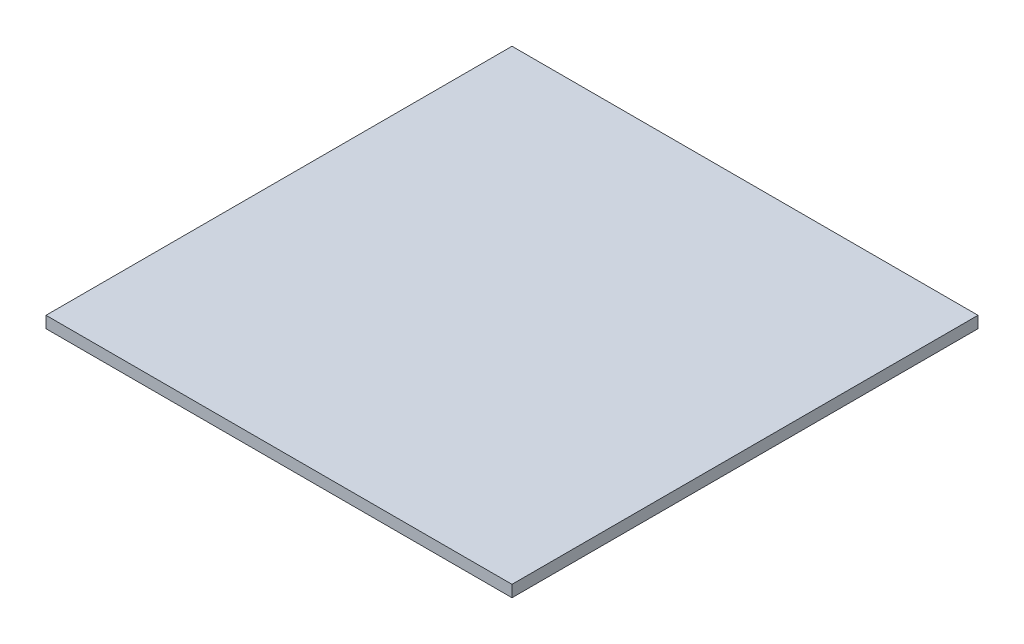
ISO-10303-21;
HEADER;
FILE_DESCRIPTION(('STEP AP214'),'2;1');
FILE_NAME('part.step','',(''),(''),'','','');
FILE_SCHEMA(('AUTOMOTIVE_DESIGN { 1 0 10303 214 1 1 1 1 }'));
ENDSEC;
DATA;
#1=APPLICATION_CONTEXT('core data for automotive mechanical design processes');
#2=APPLICATION_PROTOCOL_DEFINITION('international standard','automotive_design',2000,#1);
#3=PRODUCT_CONTEXT('',#1,'mechanical');
#4=PRODUCT('Part','Part','',(#3));
#5=PRODUCT_RELATED_PRODUCT_CATEGORY('part','',(#4));
#6=PRODUCT_DEFINITION_FORMATION('','',#4);
#7=PRODUCT_DEFINITION_CONTEXT('part definition',#1,'design');
#8=PRODUCT_DEFINITION('design','',#6,#7);
#9=PRODUCT_DEFINITION_SHAPE('','',#8);
#10=(LENGTH_UNIT() NAMED_UNIT(*) SI_UNIT(.MILLI.,.METRE.));
#11=(NAMED_UNIT(*) PLANE_ANGLE_UNIT() SI_UNIT($,.RADIAN.));
#12=(NAMED_UNIT(*) SI_UNIT($,.STERADIAN.) SOLID_ANGLE_UNIT());
#13=UNCERTAINTY_MEASURE_WITH_UNIT(LENGTH_MEASURE(1.E-05),#10,'distance_accuracy_value','');
#14=(GEOMETRIC_REPRESENTATION_CONTEXT(3) GLOBAL_UNCERTAINTY_ASSIGNED_CONTEXT((#13)) GLOBAL_UNIT_ASSIGNED_CONTEXT((#10,
#11,#12)) REPRESENTATION_CONTEXT('',''));
#15=CARTESIAN_POINT('',(0.,0.,0.));
#16=DIRECTION('',(0.,0.,1.));
#17=DIRECTION('',(1.,0.,0.));
#18=AXIS2_PLACEMENT_3D('',#15,#16,#17);
#19=CARTESIAN_POINT('',(2000.,100.,-2000.));
#20=DIRECTION('',(-1.,0.,0.));
#21=DIRECTION('',(0.,0.,1.));
#22=AXIS2_PLACEMENT_3D('',#19,#20,#21);
#23=PLANE('',#22);
#24=DIRECTION('',(0.,0.,-1.));
#25=VECTOR('',#24,1.);
#26=CARTESIAN_POINT('',(2000.,0.,-2000.));
#27=LINE('',#26,#25);
#28=CARTESIAN_POINT('',(2000.,0.,2000.));
#29=VERTEX_POINT('',#28);
#30=CARTESIAN_POINT('',(2000.,0.,-2000.));
#31=VERTEX_POINT('',#30);
#32=EDGE_CURVE('E107',#29,#31,#27,.T.);
#33=ORIENTED_EDGE('',*,*,#32,.T.);
#34=DIRECTION('',(0.,-1.,0.));
#35=VECTOR('',#34,1.);
#36=CARTESIAN_POINT('',(2000.,100.,-2000.));
#37=LINE('',#36,#35);
#38=CARTESIAN_POINT('',(2000.,100.,-2000.));
#39=VERTEX_POINT('',#38);
#40=EDGE_CURVE('E11',#39,#31,#37,.T.);
#41=ORIENTED_EDGE('',*,*,#40,.F.);
#42=DIRECTION('',(0.,0.,-1.));
#43=VECTOR('',#42,1.);
#44=CARTESIAN_POINT('',(2000.,100.,-2000.));
#45=LINE('',#44,#43);
#46=CARTESIAN_POINT('',(2000.,100.,2000.));
#47=VERTEX_POINT('',#46);
#48=EDGE_CURVE('E91',#47,#39,#45,.T.);
#49=ORIENTED_EDGE('',*,*,#48,.F.);
#50=DIRECTION('',(0.,-1.,0.));
#51=VECTOR('',#50,1.);
#52=CARTESIAN_POINT('',(2000.,100.,2000.));
#53=LINE('',#52,#51);
#54=EDGE_CURVE('E103',#47,#29,#53,.T.);
#55=ORIENTED_EDGE('',*,*,#54,.T.);
#56=EDGE_LOOP('',(#33,#41,#49,#55));
#57=FACE_BOUND('',#56,.T.);
#58=ADVANCED_FACE('F39',(#57),#23,.F.);
#59=CARTESIAN_POINT('',(-2000.,100.,-2000.));
#60=DIRECTION('',(0.,0.,1.));
#61=DIRECTION('',(1.,0.,0.));
#62=AXIS2_PLACEMENT_3D('',#59,#60,#61);
#63=PLANE('',#62);
#64=DIRECTION('',(-1.,0.,0.));
#65=VECTOR('',#64,1.);
#66=CARTESIAN_POINT('',(-2000.,0.,-2000.));
#67=LINE('',#66,#65);
#68=CARTESIAN_POINT('',(-2000.,0.,-2000.));
#69=VERTEX_POINT('',#68);
#70=EDGE_CURVE('E96',#31,#69,#67,.T.);
#71=ORIENTED_EDGE('',*,*,#70,.T.);
#72=DIRECTION('',(0.,-1.,0.));
#73=VECTOR('',#72,1.);
#74=CARTESIAN_POINT('',(-2000.,100.,-2000.));
#75=LINE('',#74,#73);
#76=CARTESIAN_POINT('',(-2000.,100.,-2000.));
#77=VERTEX_POINT('',#76);
#78=EDGE_CURVE('E48',#77,#69,#75,.T.);
#79=ORIENTED_EDGE('',*,*,#78,.F.);
#80=DIRECTION('',(-1.,0.,0.));
#81=VECTOR('',#80,1.);
#82=CARTESIAN_POINT('',(-2000.,100.,-2000.));
#83=LINE('',#82,#81);
#84=EDGE_CURVE('E86',#39,#77,#83,.T.);
#85=ORIENTED_EDGE('',*,*,#84,.F.);
#86=ORIENTED_EDGE('',*,*,#40,.T.);
#87=EDGE_LOOP('',(#71,#79,#85,#86));
#88=FACE_BOUND('',#87,.T.);
#89=ADVANCED_FACE('F95',(#88),#63,.F.);
#90=CARTESIAN_POINT('',(-2000.,100.,-2000.));
#91=DIRECTION('',(1.,0.,0.));
#92=DIRECTION('',(0.,0.,-1.));
#93=AXIS2_PLACEMENT_3D('',#90,#91,#92);
#94=PLANE('',#93);
#95=DIRECTION('',(0.,0.,1.));
#96=VECTOR('',#95,1.);
#97=CARTESIAN_POINT('',(-2000.,0.,-2000.));
#98=LINE('',#97,#96);
#99=CARTESIAN_POINT('',(-2000.,0.,2000.));
#100=VERTEX_POINT('',#99);
#101=EDGE_CURVE('E73',#69,#100,#98,.T.);
#102=ORIENTED_EDGE('',*,*,#101,.T.);
#103=DIRECTION('',(0.,-1.,0.));
#104=VECTOR('',#103,1.);
#105=CARTESIAN_POINT('',(-2000.,100.,2000.));
#106=LINE('',#105,#104);
#107=CARTESIAN_POINT('',(-2000.,100.,2000.));
#108=VERTEX_POINT('',#107);
#109=EDGE_CURVE('E98',#108,#100,#106,.T.);
#110=ORIENTED_EDGE('',*,*,#109,.F.);
#111=DIRECTION('',(0.,0.,1.));
#112=VECTOR('',#111,1.);
#113=CARTESIAN_POINT('',(-2000.,100.,-2000.));
#114=LINE('',#113,#112);
#115=EDGE_CURVE('E89',#77,#108,#114,.T.);
#116=ORIENTED_EDGE('',*,*,#115,.F.);
#117=ORIENTED_EDGE('',*,*,#78,.T.);
#118=EDGE_LOOP('',(#102,#110,#116,#117));
#119=FACE_BOUND('',#118,.T.);
#120=ADVANCED_FACE('F99',(#119),#94,.F.);
#121=CARTESIAN_POINT('',(-2000.,100.,2000.));
#122=DIRECTION('',(0.,0.,-1.));
#123=DIRECTION('',(-1.,0.,0.));
#124=AXIS2_PLACEMENT_3D('',#121,#122,#123);
#125=PLANE('',#124);
#126=DIRECTION('',(1.,0.,0.));
#127=VECTOR('',#126,1.);
#128=CARTESIAN_POINT('',(-2000.,0.,2000.));
#129=LINE('',#128,#127);
#130=EDGE_CURVE('E79',#100,#29,#129,.T.);
#131=ORIENTED_EDGE('',*,*,#130,.T.);
#132=ORIENTED_EDGE('',*,*,#54,.F.);
#133=DIRECTION('',(1.,0.,0.));
#134=VECTOR('',#133,1.);
#135=CARTESIAN_POINT('',(-2000.,100.,2000.));
#136=LINE('',#135,#134);
#137=EDGE_CURVE('E56',#108,#47,#136,.T.);
#138=ORIENTED_EDGE('',*,*,#137,.F.);
#139=ORIENTED_EDGE('',*,*,#109,.T.);
#140=EDGE_LOOP('',(#131,#132,#138,#139));
#141=FACE_BOUND('',#140,.T.);
#142=ADVANCED_FACE('F120',(#141),#125,.F.);
#143=CARTESIAN_POINT('',(0.,100.,0.));
#144=DIRECTION('',(0.,1.,0.));
#145=DIRECTION('',(0.,0.,1.));
#146=AXIS2_PLACEMENT_3D('',#143,#144,#145);
#147=PLANE('',#146);
#148=ORIENTED_EDGE('',*,*,#48,.T.);
#149=ORIENTED_EDGE('',*,*,#84,.T.);
#150=ORIENTED_EDGE('',*,*,#115,.T.);
#151=ORIENTED_EDGE('',*,*,#137,.T.);
#152=EDGE_LOOP('',(#148,#149,#150,#151));
#153=FACE_BOUND('',#152,.T.);
#154=ADVANCED_FACE('F87',(#153),#147,.T.);
#155=CARTESIAN_POINT('',(0.,0.,0.));
#156=DIRECTION('',(0.,1.,0.));
#157=DIRECTION('',(0.,0.,1.));
#158=AXIS2_PLACEMENT_3D('',#155,#156,#157);
#159=PLANE('',#158);
#160=ORIENTED_EDGE('',*,*,#32,.F.);
#161=ORIENTED_EDGE('',*,*,#130,.F.);
#162=ORIENTED_EDGE('',*,*,#101,.F.);
#163=ORIENTED_EDGE('',*,*,#70,.F.);
#164=EDGE_LOOP('',(#160,#161,#162,#163));
#165=FACE_BOUND('',#164,.T.);
#166=ADVANCED_FACE('F123',(#165),#159,.F.);
#167=CLOSED_SHELL('',(#58,#89,#120,#142,#154,#166));
#168=MANIFOLD_SOLID_BREP('B2',#167);
#169=ADVANCED_BREP_SHAPE_REPRESENTATION('',(#18,#168),#14);
#170=SHAPE_DEFINITION_REPRESENTATION(#9,#169);
ENDSEC;
END-ISO-10303-21;
